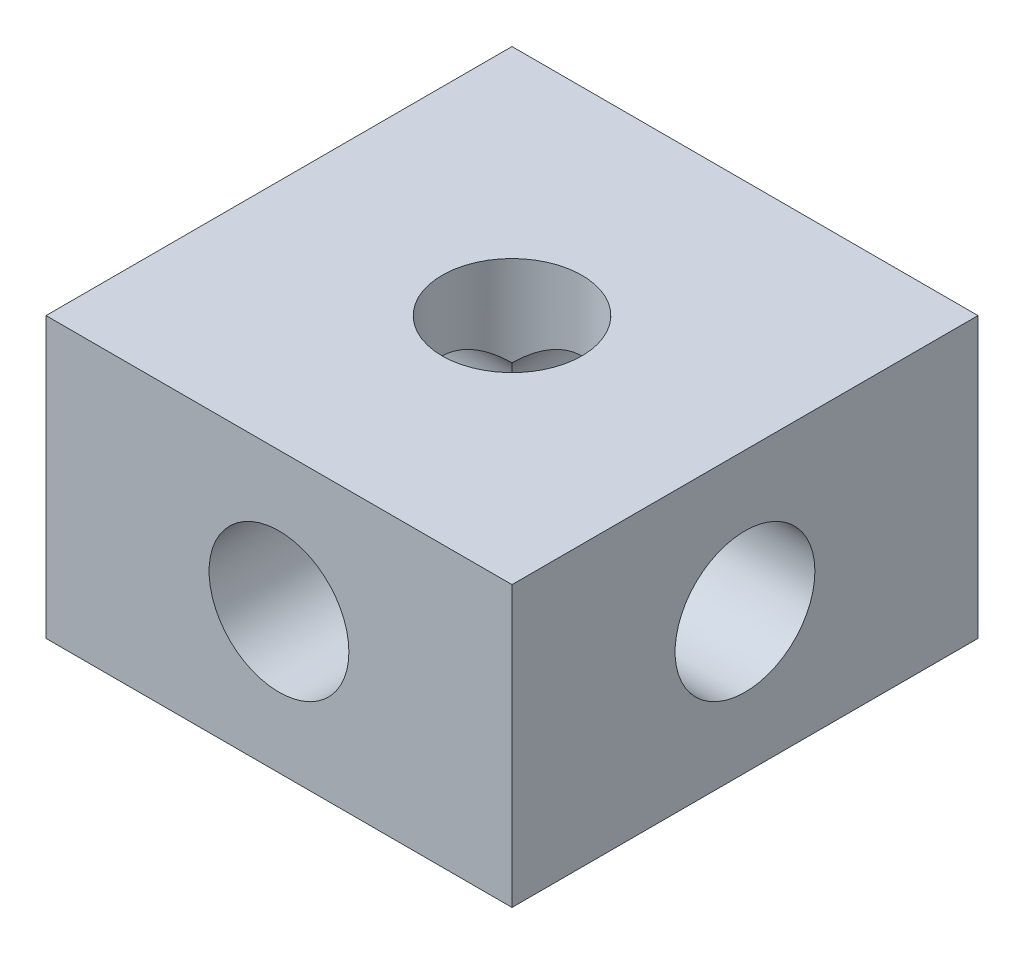
ISO-10303-21;
HEADER;
FILE_DESCRIPTION(('STEP AP214'),'2;1');
FILE_NAME('part.step','',(''),(''),'','','');
FILE_SCHEMA(('AUTOMOTIVE_DESIGN { 1 0 10303 214 1 1 1 1 }'));
ENDSEC;
DATA;
#1=APPLICATION_CONTEXT('core data for automotive mechanical design processes');
#2=APPLICATION_PROTOCOL_DEFINITION('international standard','automotive_design',2000,#1);
#3=PRODUCT_CONTEXT('',#1,'mechanical');
#4=PRODUCT('Part','Part','',(#3));
#5=PRODUCT_RELATED_PRODUCT_CATEGORY('part','',(#4));
#6=PRODUCT_DEFINITION_FORMATION('','',#4);
#7=PRODUCT_DEFINITION_CONTEXT('part definition',#1,'design');
#8=PRODUCT_DEFINITION('design','',#6,#7);
#9=PRODUCT_DEFINITION_SHAPE('','',#8);
#10=(LENGTH_UNIT() NAMED_UNIT(*) SI_UNIT(.MILLI.,.METRE.));
#11=(NAMED_UNIT(*) PLANE_ANGLE_UNIT() SI_UNIT($,.RADIAN.));
#12=(NAMED_UNIT(*) SI_UNIT($,.STERADIAN.) SOLID_ANGLE_UNIT());
#13=UNCERTAINTY_MEASURE_WITH_UNIT(LENGTH_MEASURE(1.E-05),#10,'distance_accuracy_value','');
#14=(GEOMETRIC_REPRESENTATION_CONTEXT(3) GLOBAL_UNCERTAINTY_ASSIGNED_CONTEXT((#13)) GLOBAL_UNIT_ASSIGNED_CONTEXT((#10,
#11,#12)) REPRESENTATION_CONTEXT('',''));
#15=CARTESIAN_POINT('',(0.,0.,0.));
#16=DIRECTION('',(0.,0.,1.));
#17=DIRECTION('',(1.,0.,0.));
#18=AXIS2_PLACEMENT_3D('',#15,#16,#17);
#19=CARTESIAN_POINT('',(0.,3.,0.));
#20=DIRECTION('',(0.,-1.,0.));
#21=DIRECTION('',(0.,0.,-1.));
#22=AXIS2_PLACEMENT_3D('',#19,#20,#21);
#23=CYLINDRICAL_SURFACE('',#22,1.5);
#24=CARTESIAN_POINT('',(0.,0.,0.));
#25=DIRECTION('',(0.707106781186547,-0.707106781186547,0.));
#26=DIRECTION('',(-0.707106781186547,-0.707106781186547,0.));
#27=AXIS2_PLACEMENT_3D('',#24,#25,#26);
#28=ELLIPSE('',#27,2.12132034355964,1.5);
#29=CARTESIAN_POINT('',(1.06066017177982,1.06066017177982,1.06066017177982));
#30=VERTEX_POINT('',#29);
#31=CARTESIAN_POINT('',(1.06066017177982,1.06066017177982,-1.06066017177982));
#32=VERTEX_POINT('',#31);
#33=EDGE_CURVE('E97',#30,#32,#28,.F.);
#34=ORIENTED_EDGE('',*,*,#33,.F.);
#35=CARTESIAN_POINT('',(0.,0.,0.));
#36=DIRECTION('',(0.,-0.707106781186547,0.707106781186547));
#37=DIRECTION('',(0.,-0.707106781186547,-0.707106781186547));
#38=AXIS2_PLACEMENT_3D('',#35,#36,#37);
#39=ELLIPSE('',#38,2.12132034355964,1.5);
#40=CARTESIAN_POINT('',(-1.06066017177982,1.06066017177982,1.06066017177982));
#41=VERTEX_POINT('',#40);
#42=EDGE_CURVE('E103',#41,#30,#39,.F.);
#43=ORIENTED_EDGE('',*,*,#42,.F.);
#44=CARTESIAN_POINT('',(0.,0.,0.));
#45=DIRECTION('',(-0.707106781186547,-0.707106781186547,0.));
#46=DIRECTION('',(0.707106781186547,-0.707106781186547,0.));
#47=AXIS2_PLACEMENT_3D('',#44,#45,#46);
#48=ELLIPSE('',#47,2.12132034355964,1.5);
#49=CARTESIAN_POINT('',(-1.06066017177982,1.06066017177982,-1.06066017177982));
#50=VERTEX_POINT('',#49);
#51=EDGE_CURVE('E57',#50,#41,#48,.F.);
#52=ORIENTED_EDGE('',*,*,#51,.F.);
#53=CARTESIAN_POINT('',(0.,0.,0.));
#54=DIRECTION('',(0.,-0.707106781186547,-0.707106781186547));
#55=DIRECTION('',(0.,-0.707106781186547,0.707106781186547));
#56=AXIS2_PLACEMENT_3D('',#53,#54,#55);
#57=ELLIPSE('',#56,2.12132034355964,1.5);
#58=EDGE_CURVE('E109',#32,#50,#57,.F.);
#59=ORIENTED_EDGE('',*,*,#58,.F.);
#60=EDGE_LOOP('',(#34,#43,#52,#59));
#61=FACE_BOUND('',#60,.T.);
#62=CARTESIAN_POINT('',(0.,3.,0.));
#63=DIRECTION('',(0.,1.,0.));
#64=DIRECTION('',(0.,0.,1.));
#65=AXIS2_PLACEMENT_3D('',#62,#63,#64);
#66=CIRCLE('',#65,1.5);
#67=CARTESIAN_POINT('',(0.,3.,1.5));
#68=VERTEX_POINT('',#67);
#69=EDGE_CURVE('E145',#68,#68,#66,.T.);
#70=ORIENTED_EDGE('',*,*,#69,.T.);
#71=EDGE_LOOP('',(#70));
#72=FACE_BOUND('',#71,.T.);
#73=ADVANCED_FACE('F34',(#61,#72),#23,.F.);
#74=CARTESIAN_POINT('',(0.,3.,0.));
#75=DIRECTION('',(0.,1.,0.));
#76=DIRECTION('',(0.,0.,1.));
#77=AXIS2_PLACEMENT_3D('',#74,#75,#76);
#78=PLANE('',#77);
#79=DIRECTION('',(0.,0.,-1.));
#80=VECTOR('',#79,1.);
#81=CARTESIAN_POINT('',(5.,3.,-5.));
#82=LINE('',#81,#80);
#83=CARTESIAN_POINT('',(5.,3.,5.));
#84=VERTEX_POINT('',#83);
#85=CARTESIAN_POINT('',(5.,3.,-5.));
#86=VERTEX_POINT('',#85);
#87=EDGE_CURVE('E137',#84,#86,#82,.T.);
#88=ORIENTED_EDGE('',*,*,#87,.T.);
#89=DIRECTION('',(-1.,0.,0.));
#90=VECTOR('',#89,1.);
#91=CARTESIAN_POINT('',(-5.,3.,-5.));
#92=LINE('',#91,#90);
#93=CARTESIAN_POINT('',(-5.,3.,-5.));
#94=VERTEX_POINT('',#93);
#95=EDGE_CURVE('E149',#86,#94,#92,.T.);
#96=ORIENTED_EDGE('',*,*,#95,.T.);
#97=DIRECTION('',(0.,0.,1.));
#98=VECTOR('',#97,1.);
#99=CARTESIAN_POINT('',(-5.,3.,-5.));
#100=LINE('',#99,#98);
#101=CARTESIAN_POINT('',(-5.,3.,5.));
#102=VERTEX_POINT('',#101);
#103=EDGE_CURVE('E147',#94,#102,#100,.T.);
#104=ORIENTED_EDGE('',*,*,#103,.T.);
#105=DIRECTION('',(1.,0.,0.));
#106=VECTOR('',#105,1.);
#107=CARTESIAN_POINT('',(-5.,3.,5.));
#108=LINE('',#107,#106);
#109=EDGE_CURVE('E134',#102,#84,#108,.T.);
#110=ORIENTED_EDGE('',*,*,#109,.T.);
#111=EDGE_LOOP('',(#88,#96,#104,#110));
#112=FACE_BOUND('',#111,.T.);
#113=ORIENTED_EDGE('',*,*,#69,.F.);
#114=EDGE_LOOP('',(#113));
#115=FACE_BOUND('',#114,.T.);
#116=ADVANCED_FACE('F196',(#112,#115),#78,.T.);
#117=CARTESIAN_POINT('',(0.,-3.,0.));
#118=DIRECTION('',(0.,1.,0.));
#119=DIRECTION('',(0.,0.,1.));
#120=AXIS2_PLACEMENT_3D('',#117,#118,#119);
#121=PLANE('',#120);
#122=DIRECTION('',(0.,0.,-1.));
#123=VECTOR('',#122,1.);
#124=CARTESIAN_POINT('',(5.,-3.,-5.));
#125=LINE('',#124,#123);
#126=CARTESIAN_POINT('',(5.,-3.,5.));
#127=VERTEX_POINT('',#126);
#128=CARTESIAN_POINT('',(5.,-3.,-5.));
#129=VERTEX_POINT('',#128);
#130=EDGE_CURVE('E142',#127,#129,#125,.T.);
#131=ORIENTED_EDGE('',*,*,#130,.F.);
#132=DIRECTION('',(1.,0.,0.));
#133=VECTOR('',#132,1.);
#134=CARTESIAN_POINT('',(-5.,-3.,5.));
#135=LINE('',#134,#133);
#136=CARTESIAN_POINT('',(-5.,-3.,5.));
#137=VERTEX_POINT('',#136);
#138=EDGE_CURVE('E135',#137,#127,#135,.T.);
#139=ORIENTED_EDGE('',*,*,#138,.F.);
#140=DIRECTION('',(0.,0.,1.));
#141=VECTOR('',#140,1.);
#142=CARTESIAN_POINT('',(-5.,-3.,-5.));
#143=LINE('',#142,#141);
#144=CARTESIAN_POINT('',(-5.,-3.,-5.));
#145=VERTEX_POINT('',#144);
#146=EDGE_CURVE('E138',#145,#137,#143,.T.);
#147=ORIENTED_EDGE('',*,*,#146,.F.);
#148=DIRECTION('',(-1.,0.,0.));
#149=VECTOR('',#148,1.);
#150=CARTESIAN_POINT('',(-5.,-3.,-5.));
#151=LINE('',#150,#149);
#152=EDGE_CURVE('E140',#129,#145,#151,.T.);
#153=ORIENTED_EDGE('',*,*,#152,.F.);
#154=EDGE_LOOP('',(#131,#139,#147,#153));
#155=FACE_BOUND('',#154,.T.);
#156=CARTESIAN_POINT('',(0.,-3.,0.));
#157=DIRECTION('',(0.,1.,0.));
#158=DIRECTION('',(0.,0.,1.));
#159=AXIS2_PLACEMENT_3D('',#156,#157,#158);
#160=CIRCLE('',#159,1.5);
#161=CARTESIAN_POINT('',(0.,-3.,1.5));
#162=VERTEX_POINT('',#161);
#163=EDGE_CURVE('E153',#162,#162,#160,.T.);
#164=ORIENTED_EDGE('',*,*,#163,.T.);
#165=EDGE_LOOP('',(#164));
#166=FACE_BOUND('',#165,.T.);
#167=ADVANCED_FACE('F183',(#155,#166),#121,.F.);
#168=CARTESIAN_POINT('',(5.,3.,-5.));
#169=DIRECTION('',(-1.,0.,0.));
#170=DIRECTION('',(0.,0.,1.));
#171=AXIS2_PLACEMENT_3D('',#168,#169,#170);
#172=PLANE('',#171);
#173=CARTESIAN_POINT('',(5.,0.,0.));
#174=DIRECTION('',(1.,0.,0.));
#175=DIRECTION('',(0.,0.,-1.));
#176=AXIS2_PLACEMENT_3D('',#173,#174,#175);
#177=CIRCLE('',#176,1.5);
#178=CARTESIAN_POINT('',(5.,0.,-1.5));
#179=VERTEX_POINT('',#178);
#180=EDGE_CURVE('E175',#179,#179,#177,.T.);
#181=ORIENTED_EDGE('',*,*,#180,.F.);
#182=EDGE_LOOP('',(#181));
#183=FACE_BOUND('',#182,.T.);
#184=ORIENTED_EDGE('',*,*,#130,.T.);
#185=DIRECTION('',(0.,-1.,0.));
#186=VECTOR('',#185,1.);
#187=CARTESIAN_POINT('',(5.,3.,-5.));
#188=LINE('',#187,#186);
#189=EDGE_CURVE('E122',#86,#129,#188,.T.);
#190=ORIENTED_EDGE('',*,*,#189,.F.);
#191=ORIENTED_EDGE('',*,*,#87,.F.);
#192=DIRECTION('',(0.,-1.,0.));
#193=VECTOR('',#192,1.);
#194=CARTESIAN_POINT('',(5.,3.,5.));
#195=LINE('',#194,#193);
#196=EDGE_CURVE('E131',#84,#127,#195,.T.);
#197=ORIENTED_EDGE('',*,*,#196,.T.);
#198=EDGE_LOOP('',(#184,#190,#191,#197));
#199=FACE_BOUND('',#198,.T.);
#200=ADVANCED_FACE('F36',(#183,#199),#172,.F.);
#201=CARTESIAN_POINT('',(-5.,3.,-5.));
#202=DIRECTION('',(0.,0.,1.));
#203=DIRECTION('',(1.,0.,0.));
#204=AXIS2_PLACEMENT_3D('',#201,#202,#203);
#205=PLANE('',#204);
#206=CARTESIAN_POINT('',(0.,0.,-5.));
#207=DIRECTION('',(0.,0.,1.));
#208=DIRECTION('',(1.,0.,0.));
#209=AXIS2_PLACEMENT_3D('',#206,#207,#208);
#210=CIRCLE('',#209,1.5);
#211=CARTESIAN_POINT('',(1.5,0.,-5.));
#212=VERTEX_POINT('',#211);
#213=EDGE_CURVE('E156',#212,#212,#210,.T.);
#214=ORIENTED_EDGE('',*,*,#213,.T.);
#215=EDGE_LOOP('',(#214));
#216=FACE_BOUND('',#215,.T.);
#217=ORIENTED_EDGE('',*,*,#152,.T.);
#218=DIRECTION('',(0.,-1.,0.));
#219=VECTOR('',#218,1.);
#220=CARTESIAN_POINT('',(-5.,3.,-5.));
#221=LINE('',#220,#219);
#222=EDGE_CURVE('E125',#94,#145,#221,.T.);
#223=ORIENTED_EDGE('',*,*,#222,.F.);
#224=ORIENTED_EDGE('',*,*,#95,.F.);
#225=ORIENTED_EDGE('',*,*,#189,.T.);
#226=EDGE_LOOP('',(#217,#223,#224,#225));
#227=FACE_BOUND('',#226,.T.);
#228=ADVANCED_FACE('F182',(#216,#227),#205,.F.);
#229=CARTESIAN_POINT('',(-5.,3.,-5.));
#230=DIRECTION('',(1.,0.,0.));
#231=DIRECTION('',(0.,0.,-1.));
#232=AXIS2_PLACEMENT_3D('',#229,#230,#231);
#233=PLANE('',#232);
#234=CARTESIAN_POINT('',(-5.,0.,0.));
#235=DIRECTION('',(1.,0.,0.));
#236=DIRECTION('',(0.,0.,-1.));
#237=AXIS2_PLACEMENT_3D('',#234,#235,#236);
#238=CIRCLE('',#237,1.5);
#239=CARTESIAN_POINT('',(-5.,0.,-1.5));
#240=VERTEX_POINT('',#239);
#241=EDGE_CURVE('E164',#240,#240,#238,.T.);
#242=ORIENTED_EDGE('',*,*,#241,.T.);
#243=EDGE_LOOP('',(#242));
#244=FACE_BOUND('',#243,.T.);
#245=ORIENTED_EDGE('',*,*,#146,.T.);
#246=DIRECTION('',(0.,-1.,0.));
#247=VECTOR('',#246,1.);
#248=CARTESIAN_POINT('',(-5.,3.,5.));
#249=LINE('',#248,#247);
#250=EDGE_CURVE('E128',#102,#137,#249,.T.);
#251=ORIENTED_EDGE('',*,*,#250,.F.);
#252=ORIENTED_EDGE('',*,*,#103,.F.);
#253=ORIENTED_EDGE('',*,*,#222,.T.);
#254=EDGE_LOOP('',(#245,#251,#252,#253));
#255=FACE_BOUND('',#254,.T.);
#256=ADVANCED_FACE('F203',(#244,#255),#233,.F.);
#257=CARTESIAN_POINT('',(-5.,3.,5.));
#258=DIRECTION('',(0.,0.,-1.));
#259=DIRECTION('',(-1.,0.,0.));
#260=AXIS2_PLACEMENT_3D('',#257,#258,#259);
#261=PLANE('',#260);
#262=CARTESIAN_POINT('',(0.,0.,5.));
#263=DIRECTION('',(0.,0.,1.));
#264=DIRECTION('',(1.,0.,0.));
#265=AXIS2_PLACEMENT_3D('',#262,#263,#264);
#266=CIRCLE('',#265,1.5);
#267=CARTESIAN_POINT('',(1.5,0.,5.));
#268=VERTEX_POINT('',#267);
#269=EDGE_CURVE('E161',#268,#268,#266,.T.);
#270=ORIENTED_EDGE('',*,*,#269,.F.);
#271=EDGE_LOOP('',(#270));
#272=FACE_BOUND('',#271,.T.);
#273=ORIENTED_EDGE('',*,*,#138,.T.);
#274=ORIENTED_EDGE('',*,*,#196,.F.);
#275=ORIENTED_EDGE('',*,*,#109,.F.);
#276=ORIENTED_EDGE('',*,*,#250,.T.);
#277=EDGE_LOOP('',(#273,#274,#275,#276));
#278=FACE_BOUND('',#277,.T.);
#279=ADVANCED_FACE('F201',(#272,#278),#261,.F.);
#280=CARTESIAN_POINT('',(0.,0.,0.));
#281=DIRECTION('',(0.707106781186547,-0.707106781186547,0.));
#282=DIRECTION('',(-0.707106781186547,-0.707106781186547,0.));
#283=AXIS2_PLACEMENT_3D('',#280,#281,#282);
#284=ELLIPSE('',#283,2.12132034355964,1.5);
#285=CARTESIAN_POINT('',(-1.06066017177982,-1.06066017177982,1.06066017177982));
#286=VERTEX_POINT('',#285);
#287=CARTESIAN_POINT('',(-1.06066017177982,-1.06066017177982,-1.06066017177982));
#288=VERTEX_POINT('',#287);
#289=EDGE_CURVE('E171',#286,#288,#284,.T.);
#290=ORIENTED_EDGE('',*,*,#289,.F.);
#291=CARTESIAN_POINT('',(0.,0.,0.));
#292=DIRECTION('',(0.,-0.707106781186547,-0.707106781186547));
#293=DIRECTION('',(0.,-0.707106781186547,0.707106781186547));
#294=AXIS2_PLACEMENT_3D('',#291,#292,#293);
#295=ELLIPSE('',#294,2.12132034355964,1.5);
#296=CARTESIAN_POINT('',(1.06066017177982,-1.06066017177982,1.06066017177982));
#297=VERTEX_POINT('',#296);
#298=EDGE_CURVE('E117',#297,#286,#295,.T.);
#299=ORIENTED_EDGE('',*,*,#298,.F.);
#300=CARTESIAN_POINT('',(0.,0.,0.));
#301=DIRECTION('',(-0.707106781186547,-0.707106781186547,0.));
#302=DIRECTION('',(0.707106781186547,-0.707106781186547,0.));
#303=AXIS2_PLACEMENT_3D('',#300,#301,#302);
#304=ELLIPSE('',#303,2.12132034355964,1.5);
#305=CARTESIAN_POINT('',(1.06066017177982,-1.06066017177982,-1.06066017177982));
#306=VERTEX_POINT('',#305);
#307=EDGE_CURVE('E49',#306,#297,#304,.T.);
#308=ORIENTED_EDGE('',*,*,#307,.F.);
#309=CARTESIAN_POINT('',(0.,0.,0.));
#310=DIRECTION('',(0.,-0.707106781186547,0.707106781186547));
#311=DIRECTION('',(0.,-0.707106781186547,-0.707106781186547));
#312=AXIS2_PLACEMENT_3D('',#309,#310,#311);
#313=ELLIPSE('',#312,2.12132034355964,1.5);
#314=EDGE_CURVE('E114',#288,#306,#313,.T.);
#315=ORIENTED_EDGE('',*,*,#314,.F.);
#316=EDGE_LOOP('',(#290,#299,#308,#315));
#317=FACE_BOUND('',#316,.T.);
#318=ORIENTED_EDGE('',*,*,#163,.F.);
#319=EDGE_LOOP('',(#318));
#320=FACE_BOUND('',#319,.T.);
#321=ADVANCED_FACE('F211',(#317,#320),#23,.F.);
#322=CARTESIAN_POINT('',(0.,0.,-6.));
#323=DIRECTION('',(0.,0.,1.));
#324=DIRECTION('',(1.,0.,0.));
#325=AXIS2_PLACEMENT_3D('',#322,#323,#324);
#326=CYLINDRICAL_SURFACE('',#325,1.5);
#327=ORIENTED_EDGE('',*,*,#314,.T.);
#328=CARTESIAN_POINT('',(0.,0.,0.));
#329=DIRECTION('',(0.707106781186547,0.,0.707106781186548));
#330=DIRECTION('',(-0.707106781186548,0.,0.707106781186547));
#331=AXIS2_PLACEMENT_3D('',#328,#329,#330);
#332=ELLIPSE('',#331,2.12132034355964,1.5);
#333=EDGE_CURVE('E110',#306,#32,#332,.T.);
#334=ORIENTED_EDGE('',*,*,#333,.T.);
#335=ORIENTED_EDGE('',*,*,#58,.T.);
#336=CARTESIAN_POINT('',(0.,0.,0.));
#337=DIRECTION('',(-0.707106781186548,0.,0.707106781186547));
#338=DIRECTION('',(0.707106781186547,0.,0.707106781186548));
#339=AXIS2_PLACEMENT_3D('',#336,#337,#338);
#340=ELLIPSE('',#339,2.12132034355964,1.5);
#341=EDGE_CURVE('E167',#50,#288,#340,.T.);
#342=ORIENTED_EDGE('',*,*,#341,.T.);
#343=EDGE_LOOP('',(#327,#334,#335,#342));
#344=FACE_BOUND('',#343,.T.);
#345=ORIENTED_EDGE('',*,*,#213,.F.);
#346=EDGE_LOOP('',(#345));
#347=FACE_BOUND('',#346,.T.);
#348=ADVANCED_FACE('F223',(#344,#347),#326,.F.);
#349=ORIENTED_EDGE('',*,*,#298,.T.);
#350=CARTESIAN_POINT('',(0.,0.,0.));
#351=DIRECTION('',(0.707106781186547,0.,0.707106781186548));
#352=DIRECTION('',(-0.707106781186548,0.,0.707106781186547));
#353=AXIS2_PLACEMENT_3D('',#350,#351,#352);
#354=ELLIPSE('',#353,2.12132034355964,1.5);
#355=EDGE_CURVE('E11',#286,#41,#354,.F.);
#356=ORIENTED_EDGE('',*,*,#355,.T.);
#357=ORIENTED_EDGE('',*,*,#42,.T.);
#358=CARTESIAN_POINT('',(0.,0.,0.));
#359=DIRECTION('',(-0.707106781186548,0.,0.707106781186547));
#360=DIRECTION('',(0.707106781186547,0.,0.707106781186548));
#361=AXIS2_PLACEMENT_3D('',#358,#359,#360);
#362=ELLIPSE('',#361,2.12132034355964,1.5);
#363=EDGE_CURVE('E42',#30,#297,#362,.F.);
#364=ORIENTED_EDGE('',*,*,#363,.T.);
#365=EDGE_LOOP('',(#349,#356,#357,#364));
#366=FACE_BOUND('',#365,.T.);
#367=ORIENTED_EDGE('',*,*,#269,.T.);
#368=EDGE_LOOP('',(#367));
#369=FACE_BOUND('',#368,.T.);
#370=ADVANCED_FACE('F112',(#366,#369),#326,.F.);
#371=CARTESIAN_POINT('',(-6.,0.,0.));
#372=DIRECTION('',(1.,0.,0.));
#373=DIRECTION('',(0.,0.,-1.));
#374=AXIS2_PLACEMENT_3D('',#371,#372,#373);
#375=CYLINDRICAL_SURFACE('',#374,1.5);
#376=ORIENTED_EDGE('',*,*,#180,.T.);
#377=EDGE_LOOP('',(#376));
#378=FACE_BOUND('',#377,.T.);
#379=ORIENTED_EDGE('',*,*,#307,.T.);
#380=ORIENTED_EDGE('',*,*,#363,.F.);
#381=ORIENTED_EDGE('',*,*,#33,.T.);
#382=ORIENTED_EDGE('',*,*,#333,.F.);
#383=EDGE_LOOP('',(#379,#380,#381,#382));
#384=FACE_BOUND('',#383,.T.);
#385=ADVANCED_FACE('F96',(#378,#384),#375,.F.);
#386=ORIENTED_EDGE('',*,*,#51,.T.);
#387=ORIENTED_EDGE('',*,*,#355,.F.);
#388=ORIENTED_EDGE('',*,*,#289,.T.);
#389=ORIENTED_EDGE('',*,*,#341,.F.);
#390=EDGE_LOOP('',(#386,#387,#388,#389));
#391=FACE_BOUND('',#390,.T.);
#392=ORIENTED_EDGE('',*,*,#241,.F.);
#393=EDGE_LOOP('',(#392));
#394=FACE_BOUND('',#393,.T.);
#395=ADVANCED_FACE('F282',(#391,#394),#375,.F.);
#396=CLOSED_SHELL('',(#73,#116,#167,#200,#228,#256,#279,#321,#348,#370,#385,#395));
#397=MANIFOLD_SOLID_BREP('B2',#396);
#398=ADVANCED_BREP_SHAPE_REPRESENTATION('',(#18,#397),#14);
#399=SHAPE_DEFINITION_REPRESENTATION(#9,#398);
ENDSEC;
END-ISO-10303-21;
